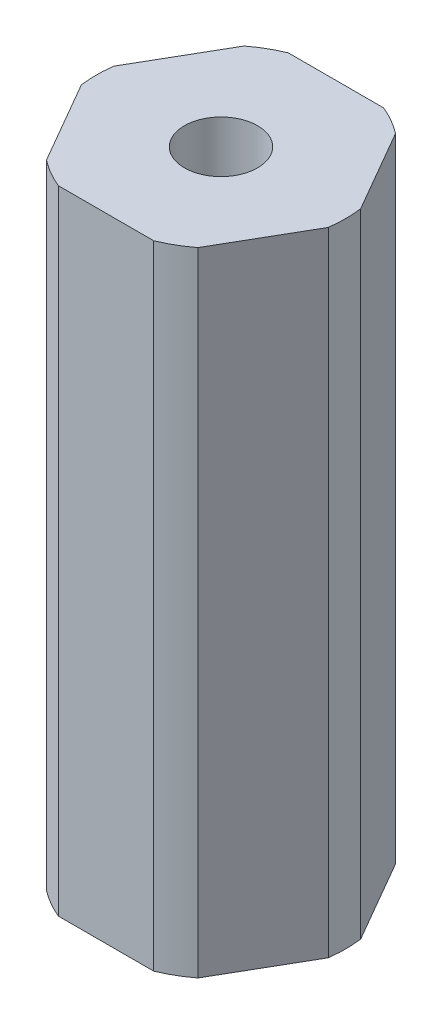
ISO-10303-21;
HEADER;
FILE_DESCRIPTION(('STEP AP214'),'2;1');
FILE_NAME('part.step','',(''),(''),'','','');
FILE_SCHEMA(('AUTOMOTIVE_DESIGN { 1 0 10303 214 1 1 1 1 }'));
ENDSEC;
DATA;
#1=APPLICATION_CONTEXT('core data for automotive mechanical design processes');
#2=APPLICATION_PROTOCOL_DEFINITION('international standard','automotive_design',2000,#1);
#3=PRODUCT_CONTEXT('',#1,'mechanical');
#4=PRODUCT('Part','Part','',(#3));
#5=PRODUCT_RELATED_PRODUCT_CATEGORY('part','',(#4));
#6=PRODUCT_DEFINITION_FORMATION('','',#4);
#7=PRODUCT_DEFINITION_CONTEXT('part definition',#1,'design');
#8=PRODUCT_DEFINITION('design','',#6,#7);
#9=PRODUCT_DEFINITION_SHAPE('','',#8);
#10=(LENGTH_UNIT() NAMED_UNIT(*) SI_UNIT(.MILLI.,.METRE.));
#11=(NAMED_UNIT(*) PLANE_ANGLE_UNIT() SI_UNIT($,.RADIAN.));
#12=(NAMED_UNIT(*) SI_UNIT($,.STERADIAN.) SOLID_ANGLE_UNIT());
#13=UNCERTAINTY_MEASURE_WITH_UNIT(LENGTH_MEASURE(1.E-05),#10,'distance_accuracy_value','');
#14=(GEOMETRIC_REPRESENTATION_CONTEXT(3) GLOBAL_UNCERTAINTY_ASSIGNED_CONTEXT((#13)) GLOBAL_UNIT_ASSIGNED_CONTEXT((#10,
#11,#12)) REPRESENTATION_CONTEXT('',''));
#15=CARTESIAN_POINT('',(0.,0.,0.));
#16=DIRECTION('',(0.,0.,1.));
#17=DIRECTION('',(1.,0.,0.));
#18=AXIS2_PLACEMENT_3D('',#15,#16,#17);
#19=CARTESIAN_POINT('',(5.49926131403119,34.925,3.175));
#20=DIRECTION('',(0.866025403784439,0.,0.5));
#21=DIRECTION('',(0.5,0.,-0.866025403784439));
#22=AXIS2_PLACEMENT_3D('',#19,#20,#21);
#23=PLANE('',#22);
#24=DIRECTION('',(-0.5,0.,0.866025403784439));
#25=VECTOR('',#24,1.);
#26=CARTESIAN_POINT('',(5.49926131403119,34.925,3.175));
#27=LINE('',#26,#25);
#28=CARTESIAN_POINT('',(6.81675182633099,34.925,0.893039494206794));
#29=VERTEX_POINT('',#28);
#30=CARTESIAN_POINT('',(4.18177080173138,34.925,5.45696050579321));
#31=VERTEX_POINT('',#30);
#32=EDGE_CURVE('E142',#29,#31,#27,.T.);
#33=ORIENTED_EDGE('',*,*,#32,.T.);
#34=DIRECTION('',(0.,-1.,0.));
#35=VECTOR('',#34,1.);
#36=CARTESIAN_POINT('',(4.18177080173138,40.6284969154038,5.45696050579321));
#37=LINE('',#36,#35);
#38=CARTESIAN_POINT('',(4.18177080173138,0.,5.45696050579321));
#39=VERTEX_POINT('',#38);
#40=EDGE_CURVE('E188',#31,#39,#37,.T.);
#41=ORIENTED_EDGE('',*,*,#40,.T.);
#42=DIRECTION('',(-0.5,0.,0.866025403784439));
#43=VECTOR('',#42,1.);
#44=CARTESIAN_POINT('',(5.49926131403119,0.,3.175));
#45=LINE('',#44,#43);
#46=CARTESIAN_POINT('',(6.81675182633099,0.,0.893039494206794));
#47=VERTEX_POINT('',#46);
#48=EDGE_CURVE('E131',#47,#39,#45,.T.);
#49=ORIENTED_EDGE('',*,*,#48,.F.);
#50=DIRECTION('',(0.,-1.,0.));
#51=VECTOR('',#50,1.);
#52=CARTESIAN_POINT('',(6.81675182633099,40.6284969154038,0.893039494206794));
#53=LINE('',#52,#51);
#54=EDGE_CURVE('E179',#47,#29,#53,.F.);
#55=ORIENTED_EDGE('',*,*,#54,.T.);
#56=EDGE_LOOP('',(#33,#41,#49,#55));
#57=FACE_BOUND('',#56,.T.);
#58=ADVANCED_FACE('F17',(#57),#23,.T.);
#59=CARTESIAN_POINT('',(0.,34.925,6.35));
#60=DIRECTION('',(0.,0.,1.));
#61=DIRECTION('',(1.,0.,0.));
#62=AXIS2_PLACEMENT_3D('',#59,#60,#61);
#63=PLANE('',#62);
#64=DIRECTION('',(-1.,0.,0.));
#65=VECTOR('',#64,1.);
#66=CARTESIAN_POINT('',(0.,34.925,6.35));
#67=LINE('',#66,#65);
#68=CARTESIAN_POINT('',(2.63498102459961,34.925,6.35));
#69=VERTEX_POINT('',#68);
#70=CARTESIAN_POINT('',(-2.63498102459961,34.925,6.35));
#71=VERTEX_POINT('',#70);
#72=EDGE_CURVE('E170',#69,#71,#67,.T.);
#73=ORIENTED_EDGE('',*,*,#72,.T.);
#74=DIRECTION('',(0.,-1.,0.));
#75=VECTOR('',#74,1.);
#76=CARTESIAN_POINT('',(-2.63498102459961,40.6284969154038,6.35));
#77=LINE('',#76,#75);
#78=CARTESIAN_POINT('',(-2.63498102459961,0.,6.35));
#79=VERTEX_POINT('',#78);
#80=EDGE_CURVE('E35',#71,#79,#77,.T.);
#81=ORIENTED_EDGE('',*,*,#80,.T.);
#82=DIRECTION('',(-1.,0.,0.));
#83=VECTOR('',#82,1.);
#84=CARTESIAN_POINT('',(0.,0.,6.35));
#85=LINE('',#84,#83);
#86=CARTESIAN_POINT('',(2.63498102459961,0.,6.35));
#87=VERTEX_POINT('',#86);
#88=EDGE_CURVE('E150',#87,#79,#85,.T.);
#89=ORIENTED_EDGE('',*,*,#88,.F.);
#90=DIRECTION('',(0.,-1.,0.));
#91=VECTOR('',#90,1.);
#92=CARTESIAN_POINT('',(2.63498102459961,40.6284969154038,6.35));
#93=LINE('',#92,#91);
#94=EDGE_CURVE('E192',#87,#69,#93,.F.);
#95=ORIENTED_EDGE('',*,*,#94,.T.);
#96=EDGE_LOOP('',(#73,#81,#89,#95));
#97=FACE_BOUND('',#96,.T.);
#98=ADVANCED_FACE('F248',(#97),#63,.T.);
#99=CARTESIAN_POINT('',(-5.49926131403119,34.925,3.175));
#100=DIRECTION('',(-0.866025403784439,0.,0.5));
#101=DIRECTION('',(0.5,0.,0.866025403784439));
#102=AXIS2_PLACEMENT_3D('',#99,#100,#101);
#103=PLANE('',#102);
#104=DIRECTION('',(-0.5,0.,-0.866025403784439));
#105=VECTOR('',#104,1.);
#106=CARTESIAN_POINT('',(-5.49926131403119,34.925,3.175));
#107=LINE('',#106,#105);
#108=CARTESIAN_POINT('',(-4.18177080173138,34.925,5.45696050579321));
#109=VERTEX_POINT('',#108);
#110=CARTESIAN_POINT('',(-6.81675182633099,34.925,0.893039494206794));
#111=VERTEX_POINT('',#110);
#112=EDGE_CURVE('E166',#109,#111,#107,.T.);
#113=ORIENTED_EDGE('',*,*,#112,.T.);
#114=DIRECTION('',(0.,-1.,0.));
#115=VECTOR('',#114,1.);
#116=CARTESIAN_POINT('',(-6.81675182633099,40.6284969154038,0.893039494206794));
#117=LINE('',#116,#115);
#118=CARTESIAN_POINT('',(-6.81675182633099,0.,0.893039494206794));
#119=VERTEX_POINT('',#118);
#120=EDGE_CURVE('E43',#111,#119,#117,.T.);
#121=ORIENTED_EDGE('',*,*,#120,.T.);
#122=DIRECTION('',(-0.5,0.,-0.866025403784439));
#123=VECTOR('',#122,1.);
#124=CARTESIAN_POINT('',(-5.49926131403119,0.,3.175));
#125=LINE('',#124,#123);
#126=CARTESIAN_POINT('',(-4.18177080173138,0.,5.45696050579321));
#127=VERTEX_POINT('',#126);
#128=EDGE_CURVE('E144',#127,#119,#125,.T.);
#129=ORIENTED_EDGE('',*,*,#128,.F.);
#130=DIRECTION('',(0.,-1.,0.));
#131=VECTOR('',#130,1.);
#132=CARTESIAN_POINT('',(-4.18177080173138,40.6284969154038,5.45696050579321));
#133=LINE('',#132,#131);
#134=EDGE_CURVE('E199',#127,#109,#133,.F.);
#135=ORIENTED_EDGE('',*,*,#134,.T.);
#136=EDGE_LOOP('',(#113,#121,#129,#135));
#137=FACE_BOUND('',#136,.T.);
#138=ADVANCED_FACE('F254',(#137),#103,.T.);
#139=CARTESIAN_POINT('',(-5.49926131403119,34.925,-3.175));
#140=DIRECTION('',(-0.866025403784439,0.,-0.5));
#141=DIRECTION('',(-0.5,0.,0.866025403784439));
#142=AXIS2_PLACEMENT_3D('',#139,#140,#141);
#143=PLANE('',#142);
#144=DIRECTION('',(0.5,0.,-0.866025403784439));
#145=VECTOR('',#144,1.);
#146=CARTESIAN_POINT('',(-5.49926131403119,34.925,-3.175));
#147=LINE('',#146,#145);
#148=CARTESIAN_POINT('',(-6.81675182633099,34.925,-0.893039494206793));
#149=VERTEX_POINT('',#148);
#150=CARTESIAN_POINT('',(-4.18177080173138,34.925,-5.45696050579321));
#151=VERTEX_POINT('',#150);
#152=EDGE_CURVE('E162',#149,#151,#147,.T.);
#153=ORIENTED_EDGE('',*,*,#152,.T.);
#154=DIRECTION('',(0.,-1.,0.));
#155=VECTOR('',#154,1.);
#156=CARTESIAN_POINT('',(-4.18177080173138,40.6284969154038,-5.45696050579321));
#157=LINE('',#156,#155);
#158=CARTESIAN_POINT('',(-4.18177080173138,0.,-5.45696050579321));
#159=VERTEX_POINT('',#158);
#160=EDGE_CURVE('E211',#151,#159,#157,.T.);
#161=ORIENTED_EDGE('',*,*,#160,.T.);
#162=DIRECTION('',(0.5,0.,-0.866025403784439));
#163=VECTOR('',#162,1.);
#164=CARTESIAN_POINT('',(-5.49926131403119,0.,-3.175));
#165=LINE('',#164,#163);
#166=CARTESIAN_POINT('',(-6.81675182633099,0.,-0.893039494206793));
#167=VERTEX_POINT('',#166);
#168=EDGE_CURVE('E137',#167,#159,#165,.T.);
#169=ORIENTED_EDGE('',*,*,#168,.F.);
#170=DIRECTION('',(0.,-1.,0.));
#171=VECTOR('',#170,1.);
#172=CARTESIAN_POINT('',(-6.81675182633099,40.6284969154038,-0.893039494206793));
#173=LINE('',#172,#171);
#174=EDGE_CURVE('E206',#167,#149,#173,.F.);
#175=ORIENTED_EDGE('',*,*,#174,.T.);
#176=EDGE_LOOP('',(#153,#161,#169,#175));
#177=FACE_BOUND('',#176,.T.);
#178=ADVANCED_FACE('F331',(#177),#143,.T.);
#179=CARTESIAN_POINT('',(0.,34.925,-6.35));
#180=DIRECTION('',(0.,0.,-1.));
#181=DIRECTION('',(-1.,0.,0.));
#182=AXIS2_PLACEMENT_3D('',#179,#180,#181);
#183=PLANE('',#182);
#184=DIRECTION('',(1.,0.,0.));
#185=VECTOR('',#184,1.);
#186=CARTESIAN_POINT('',(0.,34.925,-6.35));
#187=LINE('',#186,#185);
#188=CARTESIAN_POINT('',(-2.63498102459961,34.925,-6.35));
#189=VERTEX_POINT('',#188);
#190=CARTESIAN_POINT('',(2.63498102459961,34.925,-6.35));
#191=VERTEX_POINT('',#190);
#192=EDGE_CURVE('E129',#189,#191,#187,.T.);
#193=ORIENTED_EDGE('',*,*,#192,.T.);
#194=DIRECTION('',(0.,-1.,0.));
#195=VECTOR('',#194,1.);
#196=CARTESIAN_POINT('',(2.63498102459961,40.6284969154038,-6.35));
#197=LINE('',#196,#195);
#198=CARTESIAN_POINT('',(2.63498102459961,0.,-6.35));
#199=VERTEX_POINT('',#198);
#200=EDGE_CURVE('E110',#191,#199,#197,.T.);
#201=ORIENTED_EDGE('',*,*,#200,.T.);
#202=DIRECTION('',(1.,0.,0.));
#203=VECTOR('',#202,1.);
#204=CARTESIAN_POINT('',(0.,0.,-6.35));
#205=LINE('',#204,#203);
#206=CARTESIAN_POINT('',(-2.63498102459961,0.,-6.35));
#207=VERTEX_POINT('',#206);
#208=EDGE_CURVE('E127',#207,#199,#205,.T.);
#209=ORIENTED_EDGE('',*,*,#208,.F.);
#210=DIRECTION('',(0.,-1.,0.));
#211=VECTOR('',#210,1.);
#212=CARTESIAN_POINT('',(-2.63498102459961,40.6284969154038,-6.35));
#213=LINE('',#212,#211);
#214=EDGE_CURVE('E215',#207,#189,#213,.F.);
#215=ORIENTED_EDGE('',*,*,#214,.T.);
#216=EDGE_LOOP('',(#193,#201,#209,#215));
#217=FACE_BOUND('',#216,.T.);
#218=ADVANCED_FACE('F125',(#217),#183,.T.);
#219=CARTESIAN_POINT('',(5.49926131403119,34.925,-3.175));
#220=DIRECTION('',(0.866025403784439,0.,-0.5));
#221=DIRECTION('',(-0.5,0.,-0.866025403784439));
#222=AXIS2_PLACEMENT_3D('',#219,#220,#221);
#223=PLANE('',#222);
#224=DIRECTION('',(0.5,0.,0.866025403784439));
#225=VECTOR('',#224,1.);
#226=CARTESIAN_POINT('',(5.49926131403119,34.925,-3.175));
#227=LINE('',#226,#225);
#228=CARTESIAN_POINT('',(4.18177080173138,34.925,-5.45696050579321));
#229=VERTEX_POINT('',#228);
#230=CARTESIAN_POINT('',(6.81675182633099,34.925,-0.893039494206797));
#231=VERTEX_POINT('',#230);
#232=EDGE_CURVE('E156',#229,#231,#227,.T.);
#233=ORIENTED_EDGE('',*,*,#232,.T.);
#234=DIRECTION('',(0.,-1.,0.));
#235=VECTOR('',#234,1.);
#236=CARTESIAN_POINT('',(6.81675182633099,40.6284969154038,-0.8930394942068));
#237=LINE('',#236,#235);
#238=CARTESIAN_POINT('',(6.81675182633099,0.,-0.893039494206797));
#239=VERTEX_POINT('',#238);
#240=EDGE_CURVE('E183',#231,#239,#237,.T.);
#241=ORIENTED_EDGE('',*,*,#240,.T.);
#242=DIRECTION('',(0.5,0.,0.866025403784439));
#243=VECTOR('',#242,1.);
#244=CARTESIAN_POINT('',(5.49926131403119,0.,-3.175));
#245=LINE('',#244,#243);
#246=CARTESIAN_POINT('',(4.18177080173138,0.,-5.45696050579321));
#247=VERTEX_POINT('',#246);
#248=EDGE_CURVE('E20',#247,#239,#245,.T.);
#249=ORIENTED_EDGE('',*,*,#248,.F.);
#250=DIRECTION('',(0.,-1.,0.));
#251=VECTOR('',#250,1.);
#252=CARTESIAN_POINT('',(4.18177080173138,40.6284969154038,-5.45696050579321));
#253=LINE('',#252,#251);
#254=EDGE_CURVE('E113',#247,#229,#253,.F.);
#255=ORIENTED_EDGE('',*,*,#254,.T.);
#256=EDGE_LOOP('',(#233,#241,#249,#255));
#257=FACE_BOUND('',#256,.T.);
#258=ADVANCED_FACE('F243',(#257),#223,.T.);
#259=CARTESIAN_POINT('',(0.,34.925,0.));
#260=DIRECTION('',(0.,-1.,0.));
#261=DIRECTION('',(1.,0.,0.));
#262=AXIS2_PLACEMENT_3D('',#259,#260,#261);
#263=PLANE('',#262);
#264=CARTESIAN_POINT('',(0.,34.925,0.));
#265=DIRECTION('',(0.,-1.,0.));
#266=DIRECTION('',(0.,0.,-1.));
#267=AXIS2_PLACEMENT_3D('',#264,#265,#266);
#268=CIRCLE('',#267,2.0193);
#269=CARTESIAN_POINT('',(0.,34.925,-2.0193));
#270=VERTEX_POINT('',#269);
#271=EDGE_CURVE('E120',#270,#270,#268,.T.);
#272=ORIENTED_EDGE('',*,*,#271,.T.);
#273=EDGE_LOOP('',(#272));
#274=FACE_BOUND('',#273,.T.);
#275=CARTESIAN_POINT('',(0.,34.925,0.));
#276=DIRECTION('',(0.,-1.,0.));
#277=DIRECTION('',(0.,0.,-1.));
#278=AXIS2_PLACEMENT_3D('',#275,#276,#277);
#279=CIRCLE('',#278,6.875);
#280=EDGE_CURVE('E178',#191,#229,#279,.T.);
#281=ORIENTED_EDGE('',*,*,#280,.F.);
#282=ORIENTED_EDGE('',*,*,#192,.F.);
#283=EDGE_CURVE('E119',#151,#189,#279,.T.);
#284=ORIENTED_EDGE('',*,*,#283,.F.);
#285=ORIENTED_EDGE('',*,*,#152,.F.);
#286=EDGE_CURVE('E210',#111,#149,#279,.T.);
#287=ORIENTED_EDGE('',*,*,#286,.F.);
#288=ORIENTED_EDGE('',*,*,#112,.F.);
#289=EDGE_CURVE('E203',#71,#109,#279,.T.);
#290=ORIENTED_EDGE('',*,*,#289,.F.);
#291=ORIENTED_EDGE('',*,*,#72,.F.);
#292=EDGE_CURVE('E196',#31,#69,#279,.T.);
#293=ORIENTED_EDGE('',*,*,#292,.F.);
#294=ORIENTED_EDGE('',*,*,#32,.F.);
#295=EDGE_CURVE('E187',#231,#29,#279,.T.);
#296=ORIENTED_EDGE('',*,*,#295,.F.);
#297=ORIENTED_EDGE('',*,*,#232,.F.);
#298=EDGE_LOOP('',(#281,#282,#284,#285,#287,#288,#290,#291,#293,#294,#296,#297));
#299=FACE_BOUND('',#298,.T.);
#300=ADVANCED_FACE('F233',(#274,#299),#263,.F.);
#301=CARTESIAN_POINT('',(0.,0.,0.));
#302=DIRECTION('',(0.,-1.,0.));
#303=DIRECTION('',(1.,0.,0.));
#304=AXIS2_PLACEMENT_3D('',#301,#302,#303);
#305=PLANE('',#304);
#306=CARTESIAN_POINT('',(0.,0.,0.));
#307=DIRECTION('',(0.,-1.,0.));
#308=DIRECTION('',(0.,0.,-1.));
#309=AXIS2_PLACEMENT_3D('',#306,#307,#308);
#310=CIRCLE('',#309,2.0193);
#311=CARTESIAN_POINT('',(0.,0.,-2.0193));
#312=VERTEX_POINT('',#311);
#313=EDGE_CURVE('E223',#312,#312,#310,.T.);
#314=ORIENTED_EDGE('',*,*,#313,.F.);
#315=EDGE_LOOP('',(#314));
#316=FACE_BOUND('',#315,.T.);
#317=ORIENTED_EDGE('',*,*,#208,.T.);
#318=CARTESIAN_POINT('',(0.,0.,0.));
#319=DIRECTION('',(0.,-1.,0.));
#320=DIRECTION('',(0.,0.,-1.));
#321=AXIS2_PLACEMENT_3D('',#318,#319,#320);
#322=CIRCLE('',#321,6.875);
#323=EDGE_CURVE('E28',#199,#247,#322,.T.);
#324=ORIENTED_EDGE('',*,*,#323,.T.);
#325=ORIENTED_EDGE('',*,*,#248,.T.);
#326=EDGE_CURVE('E11',#239,#47,#322,.T.);
#327=ORIENTED_EDGE('',*,*,#326,.T.);
#328=ORIENTED_EDGE('',*,*,#48,.T.);
#329=EDGE_CURVE('E26',#39,#87,#322,.T.);
#330=ORIENTED_EDGE('',*,*,#329,.T.);
#331=ORIENTED_EDGE('',*,*,#88,.T.);
#332=EDGE_CURVE('E468',#79,#127,#322,.T.);
#333=ORIENTED_EDGE('',*,*,#332,.T.);
#334=ORIENTED_EDGE('',*,*,#128,.T.);
#335=EDGE_CURVE('E465',#119,#167,#322,.T.);
#336=ORIENTED_EDGE('',*,*,#335,.T.);
#337=ORIENTED_EDGE('',*,*,#168,.T.);
#338=EDGE_CURVE('E121',#159,#207,#322,.T.);
#339=ORIENTED_EDGE('',*,*,#338,.T.);
#340=EDGE_LOOP('',(#317,#324,#325,#327,#328,#330,#331,#333,#334,#336,#337,#339));
#341=FACE_BOUND('',#340,.T.);
#342=ADVANCED_FACE('F134',(#316,#341),#305,.T.);
#343=CARTESIAN_POINT('',(0.,40.6284969154038,0.));
#344=DIRECTION('',(0.,-1.,0.));
#345=DIRECTION('',(0.,0.,-1.));
#346=AXIS2_PLACEMENT_3D('',#343,#344,#345);
#347=CYLINDRICAL_SURFACE('',#346,6.875);
#348=ORIENTED_EDGE('',*,*,#283,.T.);
#349=ORIENTED_EDGE('',*,*,#214,.F.);
#350=ORIENTED_EDGE('',*,*,#338,.F.);
#351=ORIENTED_EDGE('',*,*,#160,.F.);
#352=EDGE_LOOP('',(#348,#349,#350,#351));
#353=FACE_BOUND('',#352,.T.);
#354=ADVANCED_FACE('F232',(#353),#347,.T.);
#355=ORIENTED_EDGE('',*,*,#286,.T.);
#356=ORIENTED_EDGE('',*,*,#174,.F.);
#357=ORIENTED_EDGE('',*,*,#335,.F.);
#358=ORIENTED_EDGE('',*,*,#120,.F.);
#359=EDGE_LOOP('',(#355,#356,#357,#358));
#360=FACE_BOUND('',#359,.T.);
#361=ADVANCED_FACE('F240',(#360),#347,.T.);
#362=ORIENTED_EDGE('',*,*,#289,.T.);
#363=ORIENTED_EDGE('',*,*,#134,.F.);
#364=ORIENTED_EDGE('',*,*,#332,.F.);
#365=ORIENTED_EDGE('',*,*,#80,.F.);
#366=EDGE_LOOP('',(#362,#363,#364,#365));
#367=FACE_BOUND('',#366,.T.);
#368=ADVANCED_FACE('F280',(#367),#347,.T.);
#369=ORIENTED_EDGE('',*,*,#292,.T.);
#370=ORIENTED_EDGE('',*,*,#94,.F.);
#371=ORIENTED_EDGE('',*,*,#329,.F.);
#372=ORIENTED_EDGE('',*,*,#40,.F.);
#373=EDGE_LOOP('',(#369,#370,#371,#372));
#374=FACE_BOUND('',#373,.T.);
#375=ADVANCED_FACE('F275',(#374),#347,.T.);
#376=ORIENTED_EDGE('',*,*,#326,.F.);
#377=ORIENTED_EDGE('',*,*,#240,.F.);
#378=ORIENTED_EDGE('',*,*,#295,.T.);
#379=ORIENTED_EDGE('',*,*,#54,.F.);
#380=EDGE_LOOP('',(#376,#377,#378,#379));
#381=FACE_BOUND('',#380,.T.);
#382=ADVANCED_FACE('F273',(#381),#347,.T.);
#383=ORIENTED_EDGE('',*,*,#280,.T.);
#384=ORIENTED_EDGE('',*,*,#254,.F.);
#385=ORIENTED_EDGE('',*,*,#323,.F.);
#386=ORIENTED_EDGE('',*,*,#200,.F.);
#387=EDGE_LOOP('',(#383,#384,#385,#386));
#388=FACE_BOUND('',#387,.T.);
#389=ADVANCED_FACE('F109',(#388),#347,.T.);
#390=CARTESIAN_POINT('',(0.,39.6345899032407,0.));
#391=DIRECTION('',(0.,-1.,0.));
#392=DIRECTION('',(0.,0.,-1.));
#393=AXIS2_PLACEMENT_3D('',#390,#391,#392);
#394=CYLINDRICAL_SURFACE('',#393,2.0193);
#395=ORIENTED_EDGE('',*,*,#313,.T.);
#396=EDGE_LOOP('',(#395));
#397=FACE_BOUND('',#396,.T.);
#398=ORIENTED_EDGE('',*,*,#271,.F.);
#399=EDGE_LOOP('',(#398));
#400=FACE_BOUND('',#399,.T.);
#401=ADVANCED_FACE('F228',(#397,#400),#394,.F.);
#402=CLOSED_SHELL('',(#58,#98,#138,#178,#218,#258,#300,#342,#354,#361,#368,#375,#382,#389,#401));
#403=MANIFOLD_SOLID_BREP('B1',#402);
#404=ADVANCED_BREP_SHAPE_REPRESENTATION('',(#18,#403),#14);
#405=SHAPE_DEFINITION_REPRESENTATION(#9,#404);
ENDSEC;
END-ISO-10303-21;
